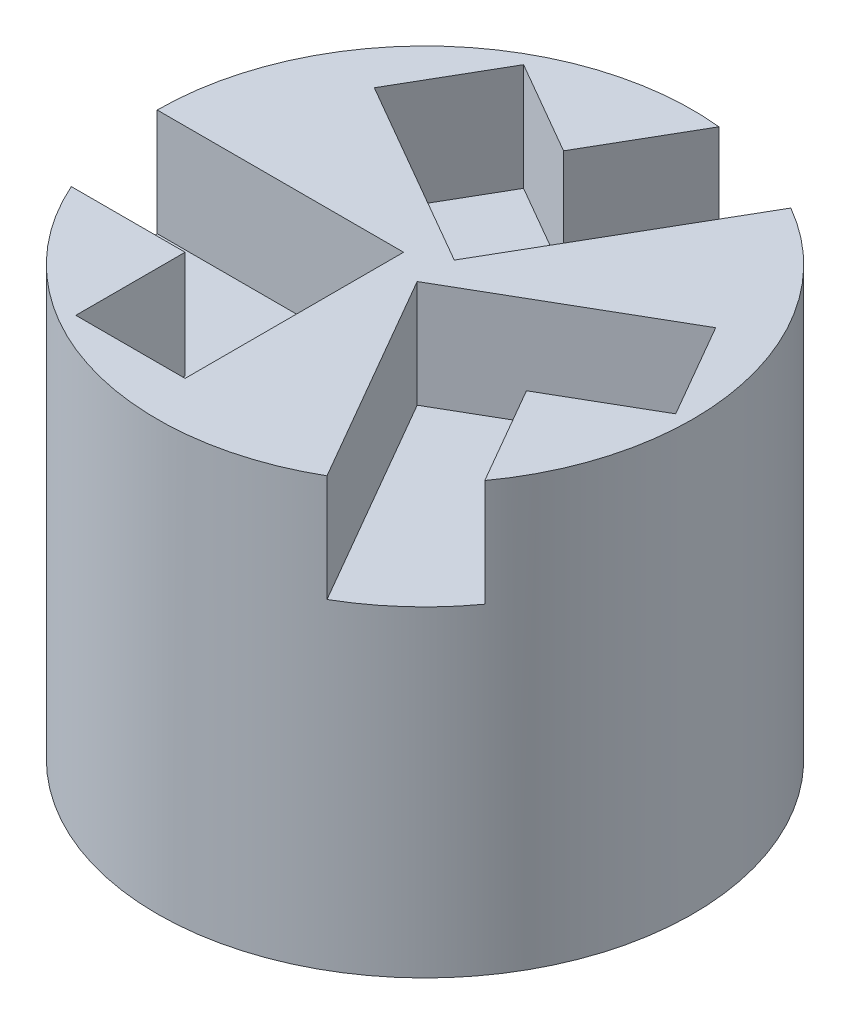
ISO-10303-21;
HEADER;
FILE_DESCRIPTION(('STEP AP214'),'2;1');
FILE_NAME('part.step','',(''),(''),'','','');
FILE_SCHEMA(('AUTOMOTIVE_DESIGN { 1 0 10303 214 1 1 1 1 }'));
ENDSEC;
DATA;
#1=APPLICATION_CONTEXT('core data for automotive mechanical design processes');
#2=APPLICATION_PROTOCOL_DEFINITION('international standard','automotive_design',2000,#1);
#3=PRODUCT_CONTEXT('',#1,'mechanical');
#4=PRODUCT('Part','Part','',(#3));
#5=PRODUCT_RELATED_PRODUCT_CATEGORY('part','',(#4));
#6=PRODUCT_DEFINITION_FORMATION('','',#4);
#7=PRODUCT_DEFINITION_CONTEXT('part definition',#1,'design');
#8=PRODUCT_DEFINITION('design','',#6,#7);
#9=PRODUCT_DEFINITION_SHAPE('','',#8);
#10=(LENGTH_UNIT() NAMED_UNIT(*) SI_UNIT(.MILLI.,.METRE.));
#11=(NAMED_UNIT(*) PLANE_ANGLE_UNIT() SI_UNIT($,.RADIAN.));
#12=(NAMED_UNIT(*) SI_UNIT($,.STERADIAN.) SOLID_ANGLE_UNIT());
#13=UNCERTAINTY_MEASURE_WITH_UNIT(LENGTH_MEASURE(1.E-05),#10,'distance_accuracy_value','');
#14=(GEOMETRIC_REPRESENTATION_CONTEXT(3) GLOBAL_UNCERTAINTY_ASSIGNED_CONTEXT((#13)) GLOBAL_UNIT_ASSIGNED_CONTEXT((#10,
#11,#12)) REPRESENTATION_CONTEXT('',''));
#15=CARTESIAN_POINT('',(0.,0.,0.));
#16=DIRECTION('',(0.,0.,1.));
#17=DIRECTION('',(1.,0.,0.));
#18=AXIS2_PLACEMENT_3D('',#15,#16,#17);
#19=CARTESIAN_POINT('',(0.,40.,0.));
#20=DIRECTION('',(0.,-1.,0.));
#21=DIRECTION('',(0.,0.,-1.));
#22=AXIS2_PLACEMENT_3D('',#19,#20,#21);
#23=CYLINDRICAL_SURFACE('',#22,25.);
#24=CARTESIAN_POINT('',(0.,30.,0.));
#25=DIRECTION('',(0.,1.,0.));
#26=DIRECTION('',(0.866025403784443,0.,-0.499999999999992));
#27=AXIS2_PLACEMENT_3D('',#24,#25,#26);
#28=CIRCLE('',#27,25.);
#29=CARTESIAN_POINT('',(12.4999999999998,30.,21.6506350946111));
#30=VERTEX_POINT('',#29);
#31=CARTESIAN_POINT('',(20.2457332127508,30.,14.6666385609695));
#32=VERTEX_POINT('',#31);
#33=EDGE_CURVE('E172',#30,#32,#28,.T.);
#34=ORIENTED_EDGE('',*,*,#33,.F.);
#35=DIRECTION('',(0.,1.,0.));
#36=VECTOR('',#35,1.);
#37=CARTESIAN_POINT('',(12.4999999999998,30.,21.6506350946111));
#38=LINE('',#37,#36);
#39=CARTESIAN_POINT('',(12.4999999999998,40.,21.6506350946111));
#40=VERTEX_POINT('',#39);
#41=EDGE_CURVE('E217',#30,#40,#38,.T.);
#42=ORIENTED_EDGE('',*,*,#41,.T.);
#43=CARTESIAN_POINT('',(0.,40.,0.));
#44=DIRECTION('',(0.,1.,0.));
#45=DIRECTION('',(0.,0.,1.));
#46=AXIS2_PLACEMENT_3D('',#43,#44,#45);
#47=CIRCLE('',#46,25.);
#48=CARTESIAN_POINT('',(-22.8245481882994,40.,10.2));
#49=VERTEX_POINT('',#48);
#50=EDGE_CURVE('E11',#49,#40,#47,.T.);
#51=ORIENTED_EDGE('',*,*,#50,.F.);
#52=DIRECTION('',(0.,1.,0.));
#53=VECTOR('',#52,1.);
#54=CARTESIAN_POINT('',(-22.8245481882994,30.,10.2));
#55=LINE('',#54,#53);
#56=CARTESIAN_POINT('',(-22.8245481882994,30.,10.2));
#57=VERTEX_POINT('',#56);
#58=EDGE_CURVE('E258',#57,#49,#55,.T.);
#59=ORIENTED_EDGE('',*,*,#58,.F.);
#60=CARTESIAN_POINT('',(0.,30.,0.));
#61=DIRECTION('',(0.,1.,0.));
#62=DIRECTION('',(0.,0.,1.));
#63=AXIS2_PLACEMENT_3D('',#60,#61,#62);
#64=CIRCLE('',#63,25.);
#65=CARTESIAN_POINT('',(-25.,30.,0.));
#66=VERTEX_POINT('',#65);
#67=EDGE_CURVE('E239',#66,#57,#64,.T.);
#68=ORIENTED_EDGE('',*,*,#67,.F.);
#69=DIRECTION('',(0.,1.,0.));
#70=VECTOR('',#69,1.);
#71=CARTESIAN_POINT('',(-25.,30.,0.));
#72=LINE('',#71,#70);
#73=CARTESIAN_POINT('',(-25.,40.,0.));
#74=VERTEX_POINT('',#73);
#75=EDGE_CURVE('E272',#66,#74,#72,.T.);
#76=ORIENTED_EDGE('',*,*,#75,.T.);
#77=CARTESIAN_POINT('',(2.57881497554853,40.,-24.8666385609693));
#78=VERTEX_POINT('',#77);
#79=EDGE_CURVE('E47',#78,#74,#47,.T.);
#80=ORIENTED_EDGE('',*,*,#79,.F.);
#81=DIRECTION('',(0.,1.,0.));
#82=VECTOR('',#81,1.);
#83=CARTESIAN_POINT('',(2.57881497554853,30.,-24.8666385609693));
#84=LINE('',#83,#82);
#85=CARTESIAN_POINT('',(2.57881497554853,30.,-24.8666385609693));
#86=VERTEX_POINT('',#85);
#87=EDGE_CURVE('E54',#86,#78,#84,.T.);
#88=ORIENTED_EDGE('',*,*,#87,.F.);
#89=CARTESIAN_POINT('',(0.,30.,0.));
#90=DIRECTION('',(0.,1.,0.));
#91=DIRECTION('',(-0.866025403784436,0.,-0.500000000000004));
#92=AXIS2_PLACEMENT_3D('',#89,#90,#91);
#93=CIRCLE('',#92,25.);
#94=CARTESIAN_POINT('',(12.5000000000001,30.,-21.6506350946109));
#95=VERTEX_POINT('',#94);
#96=EDGE_CURVE('E195',#95,#86,#93,.T.);
#97=ORIENTED_EDGE('',*,*,#96,.F.);
#98=DIRECTION('',(0.,1.,0.));
#99=VECTOR('',#98,1.);
#100=CARTESIAN_POINT('',(12.5000000000001,30.,-21.6506350946109));
#101=LINE('',#100,#99);
#102=CARTESIAN_POINT('',(12.5000000000001,40.,-21.6506350946109));
#103=VERTEX_POINT('',#102);
#104=EDGE_CURVE('E227',#95,#103,#101,.T.);
#105=ORIENTED_EDGE('',*,*,#104,.T.);
#106=CARTESIAN_POINT('',(20.2457332127508,40.,14.6666385609695));
#107=VERTEX_POINT('',#106);
#108=EDGE_CURVE('E46',#107,#103,#47,.T.);
#109=ORIENTED_EDGE('',*,*,#108,.F.);
#110=DIRECTION('',(0.,1.,0.));
#111=VECTOR('',#110,1.);
#112=CARTESIAN_POINT('',(20.2457332127508,30.,14.6666385609695));
#113=LINE('',#112,#111);
#114=EDGE_CURVE('E62',#32,#107,#113,.T.);
#115=ORIENTED_EDGE('',*,*,#114,.F.);
#116=EDGE_LOOP('',(#34,#42,#51,#59,#68,#76,#80,#88,#97,#105,#109,#115));
#117=FACE_BOUND('',#116,.T.);
#118=CARTESIAN_POINT('',(0.,0.,0.));
#119=DIRECTION('',(0.,1.,0.));
#120=DIRECTION('',(0.,0.,1.));
#121=AXIS2_PLACEMENT_3D('',#118,#119,#120);
#122=CIRCLE('',#121,25.);
#123=CARTESIAN_POINT('',(0.,0.,25.));
#124=VERTEX_POINT('',#123);
#125=EDGE_CURVE('E41',#124,#124,#122,.T.);
#126=ORIENTED_EDGE('',*,*,#125,.T.);
#127=EDGE_LOOP('',(#126));
#128=FACE_BOUND('',#127,.T.);
#129=ADVANCED_FACE('F38',(#117,#128),#23,.T.);
#130=CARTESIAN_POINT('',(0.,40.,0.));
#131=DIRECTION('',(0.,1.,0.));
#132=DIRECTION('',(0.,0.,1.));
#133=AXIS2_PLACEMENT_3D('',#130,#131,#132);
#134=PLANE('',#133);
#135=DIRECTION('',(0.499999999999992,0.,0.866025403784443));
#136=VECTOR('',#135,1.);
#137=CARTESIAN_POINT('',(12.4999999999998,40.,21.6506350946111));
#138=LINE('',#137,#136);
#139=CARTESIAN_POINT('',(0.999999999999984,40.,1.73205080756889));
#140=VERTEX_POINT('',#139);
#141=EDGE_CURVE('E182',#140,#40,#138,.T.);
#142=ORIENTED_EDGE('',*,*,#141,.F.);
#143=DIRECTION('',(-0.866025403784443,0.,0.499999999999992));
#144=VECTOR('',#143,1.);
#145=CARTESIAN_POINT('',(0.999999999999984,40.,1.73205080756889));
#146=LINE('',#145,#144);
#147=CARTESIAN_POINT('',(18.6669182372026,40.,-8.46794919243095));
#148=VERTEX_POINT('',#147);
#149=EDGE_CURVE('E319',#148,#140,#146,.T.);
#150=ORIENTED_EDGE('',*,*,#149,.F.);
#151=DIRECTION('',(-0.499999999999992,0.,-0.866025403784443));
#152=VECTOR('',#151,1.);
#153=CARTESIAN_POINT('',(18.6669182372026,40.,-8.46794919243095));
#154=LINE('',#153,#152);
#155=CARTESIAN_POINT('',(23.7669182372025,40.,0.36550992617037));
#156=VERTEX_POINT('',#155);
#157=EDGE_CURVE('E308',#156,#148,#154,.T.);
#158=ORIENTED_EDGE('',*,*,#157,.F.);
#159=DIRECTION('',(0.866025403784443,0.,-0.499999999999992));
#160=VECTOR('',#159,1.);
#161=CARTESIAN_POINT('',(23.7669182372025,40.,0.36550992617037));
#162=LINE('',#161,#160);
#163=CARTESIAN_POINT('',(14.9334591186012,40.,5.46550992617029));
#164=VERTEX_POINT('',#163);
#165=EDGE_CURVE('E314',#164,#156,#162,.T.);
#166=ORIENTED_EDGE('',*,*,#165,.F.);
#167=DIRECTION('',(-0.499999999999992,0.,-0.866025403784443));
#168=VECTOR('',#167,1.);
#169=CARTESIAN_POINT('',(14.9334591186012,40.,5.46550992617029));
#170=LINE('',#169,#168);
#171=EDGE_CURVE('E316',#107,#164,#170,.T.);
#172=ORIENTED_EDGE('',*,*,#171,.F.);
#173=ORIENTED_EDGE('',*,*,#108,.T.);
#174=DIRECTION('',(0.500000000000004,0.,-0.866025403784436));
#175=VECTOR('',#174,1.);
#176=CARTESIAN_POINT('',(12.5000000000001,40.,-21.6506350946109));
#177=LINE('',#176,#175);
#178=CARTESIAN_POINT('',(1.00000000000001,40.,-1.73205080756887));
#179=VERTEX_POINT('',#178);
#180=EDGE_CURVE('E199',#179,#103,#177,.T.);
#181=ORIENTED_EDGE('',*,*,#180,.F.);
#182=DIRECTION('',(0.866025403784437,0.,0.500000000000004));
#183=VECTOR('',#182,1.);
#184=CARTESIAN_POINT('',(1.00000000000001,40.,-1.73205080756887));
#185=LINE('',#184,#183);
#186=CARTESIAN_POINT('',(-16.6669182372025,40.,-11.932050807569));
#187=VERTEX_POINT('',#186);
#188=EDGE_CURVE('E223',#187,#179,#185,.T.);
#189=ORIENTED_EDGE('',*,*,#188,.F.);
#190=DIRECTION('',(-0.500000000000004,0.,0.866025403784436));
#191=VECTOR('',#190,1.);
#192=CARTESIAN_POINT('',(-16.6669182372025,40.,-11.932050807569));
#193=LINE('',#192,#191);
#194=CARTESIAN_POINT('',(-11.5669182372025,40.,-20.7655099261702));
#195=VERTEX_POINT('',#194);
#196=EDGE_CURVE('E220',#195,#187,#193,.T.);
#197=ORIENTED_EDGE('',*,*,#196,.F.);
#198=DIRECTION('',(-0.866025403784436,0.,-0.500000000000004));
#199=VECTOR('',#198,1.);
#200=CARTESIAN_POINT('',(-11.5669182372025,40.,-20.7655099261702));
#201=LINE('',#200,#199);
#202=CARTESIAN_POINT('',(-2.7334591186012,40.,-15.6655099261702));
#203=VERTEX_POINT('',#202);
#204=EDGE_CURVE('E216',#203,#195,#201,.T.);
#205=ORIENTED_EDGE('',*,*,#204,.F.);
#206=DIRECTION('',(-0.500000000000004,0.,0.866025403784436));
#207=VECTOR('',#206,1.);
#208=CARTESIAN_POINT('',(-2.7334591186012,40.,-15.6655099261702));
#209=LINE('',#208,#207);
#210=EDGE_CURVE('E214',#78,#203,#209,.T.);
#211=ORIENTED_EDGE('',*,*,#210,.F.);
#212=ORIENTED_EDGE('',*,*,#79,.T.);
#213=DIRECTION('',(-1.,0.,0.));
#214=VECTOR('',#213,1.);
#215=CARTESIAN_POINT('',(-25.,40.,0.));
#216=LINE('',#215,#214);
#217=CARTESIAN_POINT('',(-2.,40.,0.));
#218=VERTEX_POINT('',#217);
#219=EDGE_CURVE('E243',#218,#74,#216,.T.);
#220=ORIENTED_EDGE('',*,*,#219,.F.);
#221=DIRECTION('',(0.,0.,-1.));
#222=VECTOR('',#221,1.);
#223=CARTESIAN_POINT('',(-2.,40.,0.));
#224=LINE('',#223,#222);
#225=CARTESIAN_POINT('',(-2.,40.,20.4));
#226=VERTEX_POINT('',#225);
#227=EDGE_CURVE('E267',#226,#218,#224,.T.);
#228=ORIENTED_EDGE('',*,*,#227,.F.);
#229=DIRECTION('',(1.,0.,0.));
#230=VECTOR('',#229,1.);
#231=CARTESIAN_POINT('',(-2.,40.,20.4));
#232=LINE('',#231,#230);
#233=CARTESIAN_POINT('',(-12.2,40.,20.4));
#234=VERTEX_POINT('',#233);
#235=EDGE_CURVE('E264',#234,#226,#232,.T.);
#236=ORIENTED_EDGE('',*,*,#235,.F.);
#237=DIRECTION('',(0.,0.,1.));
#238=VECTOR('',#237,1.);
#239=CARTESIAN_POINT('',(-12.2,40.,20.4));
#240=LINE('',#239,#238);
#241=CARTESIAN_POINT('',(-12.2,40.,10.2));
#242=VERTEX_POINT('',#241);
#243=EDGE_CURVE('E261',#242,#234,#240,.T.);
#244=ORIENTED_EDGE('',*,*,#243,.F.);
#245=DIRECTION('',(1.,0.,0.));
#246=VECTOR('',#245,1.);
#247=CARTESIAN_POINT('',(-12.2,40.,10.2));
#248=LINE('',#247,#246);
#249=EDGE_CURVE('E229',#49,#242,#248,.T.);
#250=ORIENTED_EDGE('',*,*,#249,.F.);
#251=ORIENTED_EDGE('',*,*,#50,.T.);
#252=EDGE_LOOP('',(#142,#150,#158,#166,#172,#173,#181,#189,#197,#205,#211,#212,#220,#228,#236,
#244,#250,#251));
#253=FACE_BOUND('',#252,.T.);
#254=ADVANCED_FACE('F292',(#253),#134,.T.);
#255=CARTESIAN_POINT('',(0.,0.,0.));
#256=DIRECTION('',(0.,1.,0.));
#257=DIRECTION('',(0.,0.,1.));
#258=AXIS2_PLACEMENT_3D('',#255,#256,#257);
#259=PLANE('',#258);
#260=CARTESIAN_POINT('',(0.,0.,0.));
#261=DIRECTION('',(0.,-1.,0.));
#262=DIRECTION('',(0.,0.,-1.));
#263=AXIS2_PLACEMENT_3D('',#260,#261,#262);
#264=CIRCLE('',#263,15.1);
#265=CARTESIAN_POINT('',(0.,0.,-15.1));
#266=VERTEX_POINT('',#265);
#267=EDGE_CURVE('E327',#266,#266,#264,.T.);
#268=ORIENTED_EDGE('',*,*,#267,.F.);
#269=EDGE_LOOP('',(#268));
#270=FACE_BOUND('',#269,.T.);
#271=ORIENTED_EDGE('',*,*,#125,.F.);
#272=EDGE_LOOP('',(#271));
#273=FACE_BOUND('',#272,.T.);
#274=ADVANCED_FACE('F341',(#270,#273),#259,.F.);
#275=CARTESIAN_POINT('',(-25.,30.,0.));
#276=DIRECTION('',(0.,0.,-1.));
#277=DIRECTION('',(-1.,0.,0.));
#278=AXIS2_PLACEMENT_3D('',#275,#276,#277);
#279=PLANE('',#278);
#280=ORIENTED_EDGE('',*,*,#219,.T.);
#281=ORIENTED_EDGE('',*,*,#75,.F.);
#282=DIRECTION('',(-1.,0.,0.));
#283=VECTOR('',#282,1.);
#284=CARTESIAN_POINT('',(-25.,30.,0.));
#285=LINE('',#284,#283);
#286=CARTESIAN_POINT('',(-2.,30.,0.));
#287=VERTEX_POINT('',#286);
#288=EDGE_CURVE('E255',#287,#66,#285,.T.);
#289=ORIENTED_EDGE('',*,*,#288,.F.);
#290=DIRECTION('',(0.,1.,0.));
#291=VECTOR('',#290,1.);
#292=CARTESIAN_POINT('',(-2.,30.,0.));
#293=LINE('',#292,#291);
#294=EDGE_CURVE('E275',#287,#218,#293,.T.);
#295=ORIENTED_EDGE('',*,*,#294,.T.);
#296=EDGE_LOOP('',(#280,#281,#289,#295));
#297=FACE_BOUND('',#296,.T.);
#298=ADVANCED_FACE('F344',(#297),#279,.F.);
#299=CARTESIAN_POINT('',(-2.,30.,0.));
#300=DIRECTION('',(1.,0.,0.));
#301=DIRECTION('',(0.,0.,-1.));
#302=AXIS2_PLACEMENT_3D('',#299,#300,#301);
#303=PLANE('',#302);
#304=ORIENTED_EDGE('',*,*,#227,.T.);
#305=ORIENTED_EDGE('',*,*,#294,.F.);
#306=DIRECTION('',(0.,0.,-1.));
#307=VECTOR('',#306,1.);
#308=CARTESIAN_POINT('',(-2.,30.,0.));
#309=LINE('',#308,#307);
#310=CARTESIAN_POINT('',(-2.,30.,20.4));
#311=VERTEX_POINT('',#310);
#312=EDGE_CURVE('E252',#311,#287,#309,.T.);
#313=ORIENTED_EDGE('',*,*,#312,.F.);
#314=DIRECTION('',(0.,1.,0.));
#315=VECTOR('',#314,1.);
#316=CARTESIAN_POINT('',(-2.,30.,20.4));
#317=LINE('',#316,#315);
#318=EDGE_CURVE('E277',#311,#226,#317,.T.);
#319=ORIENTED_EDGE('',*,*,#318,.T.);
#320=EDGE_LOOP('',(#304,#305,#313,#319));
#321=FACE_BOUND('',#320,.T.);
#322=ADVANCED_FACE('F399',(#321),#303,.F.);
#323=CARTESIAN_POINT('',(-2.,30.,20.4));
#324=DIRECTION('',(0.,0.,1.));
#325=DIRECTION('',(1.,0.,0.));
#326=AXIS2_PLACEMENT_3D('',#323,#324,#325);
#327=PLANE('',#326);
#328=ORIENTED_EDGE('',*,*,#235,.T.);
#329=ORIENTED_EDGE('',*,*,#318,.F.);
#330=DIRECTION('',(1.,0.,0.));
#331=VECTOR('',#330,1.);
#332=CARTESIAN_POINT('',(-2.,30.,20.4));
#333=LINE('',#332,#331);
#334=CARTESIAN_POINT('',(-12.2,30.,20.4));
#335=VERTEX_POINT('',#334);
#336=EDGE_CURVE('E249',#335,#311,#333,.T.);
#337=ORIENTED_EDGE('',*,*,#336,.F.);
#338=DIRECTION('',(0.,1.,0.));
#339=VECTOR('',#338,1.);
#340=CARTESIAN_POINT('',(-12.2,30.,20.4));
#341=LINE('',#340,#339);
#342=EDGE_CURVE('E279',#335,#234,#341,.T.);
#343=ORIENTED_EDGE('',*,*,#342,.T.);
#344=EDGE_LOOP('',(#328,#329,#337,#343));
#345=FACE_BOUND('',#344,.T.);
#346=ADVANCED_FACE('F395',(#345),#327,.F.);
#347=CARTESIAN_POINT('',(-12.2,30.,20.4));
#348=DIRECTION('',(-1.,0.,0.));
#349=DIRECTION('',(0.,0.,1.));
#350=AXIS2_PLACEMENT_3D('',#347,#348,#349);
#351=PLANE('',#350);
#352=ORIENTED_EDGE('',*,*,#243,.T.);
#353=ORIENTED_EDGE('',*,*,#342,.F.);
#354=DIRECTION('',(0.,0.,1.));
#355=VECTOR('',#354,1.);
#356=CARTESIAN_POINT('',(-12.2,30.,20.4));
#357=LINE('',#356,#355);
#358=CARTESIAN_POINT('',(-12.2,30.,10.2));
#359=VERTEX_POINT('',#358);
#360=EDGE_CURVE('E246',#359,#335,#357,.T.);
#361=ORIENTED_EDGE('',*,*,#360,.F.);
#362=DIRECTION('',(0.,1.,0.));
#363=VECTOR('',#362,1.);
#364=CARTESIAN_POINT('',(-12.2,30.,10.2));
#365=LINE('',#364,#363);
#366=EDGE_CURVE('E281',#359,#242,#365,.T.);
#367=ORIENTED_EDGE('',*,*,#366,.T.);
#368=EDGE_LOOP('',(#352,#353,#361,#367));
#369=FACE_BOUND('',#368,.T.);
#370=ADVANCED_FACE('F392',(#369),#351,.F.);
#371=CARTESIAN_POINT('',(-12.2,30.,10.2));
#372=DIRECTION('',(0.,0.,1.));
#373=DIRECTION('',(1.,0.,0.));
#374=AXIS2_PLACEMENT_3D('',#371,#372,#373);
#375=PLANE('',#374);
#376=ORIENTED_EDGE('',*,*,#249,.T.);
#377=ORIENTED_EDGE('',*,*,#366,.F.);
#378=DIRECTION('',(1.,0.,0.));
#379=VECTOR('',#378,1.);
#380=CARTESIAN_POINT('',(-12.2,30.,10.2));
#381=LINE('',#380,#379);
#382=EDGE_CURVE('E242',#57,#359,#381,.T.);
#383=ORIENTED_EDGE('',*,*,#382,.F.);
#384=ORIENTED_EDGE('',*,*,#58,.T.);
#385=EDGE_LOOP('',(#376,#377,#383,#384));
#386=FACE_BOUND('',#385,.T.);
#387=ADVANCED_FACE('F286',(#386),#375,.F.);
#388=CARTESIAN_POINT('',(0.,30.,0.));
#389=DIRECTION('',(0.,1.,0.));
#390=DIRECTION('',(0.,0.,1.));
#391=AXIS2_PLACEMENT_3D('',#388,#389,#390);
#392=PLANE('',#391);
#393=ORIENTED_EDGE('',*,*,#67,.T.);
#394=ORIENTED_EDGE('',*,*,#382,.T.);
#395=ORIENTED_EDGE('',*,*,#360,.T.);
#396=ORIENTED_EDGE('',*,*,#336,.T.);
#397=ORIENTED_EDGE('',*,*,#312,.T.);
#398=ORIENTED_EDGE('',*,*,#288,.T.);
#399=EDGE_LOOP('',(#393,#394,#395,#396,#397,#398));
#400=FACE_BOUND('',#399,.T.);
#401=ADVANCED_FACE('F391',(#400),#392,.T.);
#402=CARTESIAN_POINT('',(12.5000000000001,30.,-21.6506350946109));
#403=DIRECTION('',(0.866025403784436,0.,0.500000000000004));
#404=DIRECTION('',(0.500000000000004,0.,-0.866025403784436));
#405=AXIS2_PLACEMENT_3D('',#402,#403,#404);
#406=PLANE('',#405);
#407=ORIENTED_EDGE('',*,*,#180,.T.);
#408=ORIENTED_EDGE('',*,*,#104,.F.);
#409=DIRECTION('',(0.500000000000004,0.,-0.866025403784436));
#410=VECTOR('',#409,1.);
#411=CARTESIAN_POINT('',(12.5000000000001,30.,-21.6506350946109));
#412=LINE('',#411,#410);
#413=CARTESIAN_POINT('',(1.00000000000001,30.,-1.73205080756887));
#414=VERTEX_POINT('',#413);
#415=EDGE_CURVE('E211',#414,#95,#412,.T.);
#416=ORIENTED_EDGE('',*,*,#415,.F.);
#417=DIRECTION('',(0.,1.,0.));
#418=VECTOR('',#417,1.);
#419=CARTESIAN_POINT('',(1.00000000000001,30.,-1.73205080756887));
#420=LINE('',#419,#418);
#421=EDGE_CURVE('E230',#414,#179,#420,.T.);
#422=ORIENTED_EDGE('',*,*,#421,.T.);
#423=EDGE_LOOP('',(#407,#408,#416,#422));
#424=FACE_BOUND('',#423,.T.);
#425=ADVANCED_FACE('F353',(#424),#406,.F.);
#426=CARTESIAN_POINT('',(1.00000000000001,30.,-1.73205080756887));
#427=DIRECTION('',(-0.500000000000004,0.,0.866025403784436));
#428=DIRECTION('',(0.866025403784436,0.,0.500000000000004));
#429=AXIS2_PLACEMENT_3D('',#426,#427,#428);
#430=PLANE('',#429);
#431=ORIENTED_EDGE('',*,*,#188,.T.);
#432=ORIENTED_EDGE('',*,*,#421,.F.);
#433=DIRECTION('',(0.866025403784437,0.,0.500000000000004));
#434=VECTOR('',#433,1.);
#435=CARTESIAN_POINT('',(1.00000000000001,30.,-1.73205080756887));
#436=LINE('',#435,#434);
#437=CARTESIAN_POINT('',(-16.6669182372025,30.,-11.932050807569));
#438=VERTEX_POINT('',#437);
#439=EDGE_CURVE('E208',#438,#414,#436,.T.);
#440=ORIENTED_EDGE('',*,*,#439,.F.);
#441=DIRECTION('',(0.,1.,0.));
#442=VECTOR('',#441,1.);
#443=CARTESIAN_POINT('',(-16.6669182372025,30.,-11.932050807569));
#444=LINE('',#443,#442);
#445=EDGE_CURVE('E232',#438,#187,#444,.T.);
#446=ORIENTED_EDGE('',*,*,#445,.T.);
#447=EDGE_LOOP('',(#431,#432,#440,#446));
#448=FACE_BOUND('',#447,.T.);
#449=ADVANCED_FACE('F361',(#448),#430,.F.);
#450=CARTESIAN_POINT('',(-16.6669182372025,30.,-11.932050807569));
#451=DIRECTION('',(-0.866025403784436,0.,-0.500000000000004));
#452=DIRECTION('',(-0.500000000000004,0.,0.866025403784436));
#453=AXIS2_PLACEMENT_3D('',#450,#451,#452);
#454=PLANE('',#453);
#455=ORIENTED_EDGE('',*,*,#196,.T.);
#456=ORIENTED_EDGE('',*,*,#445,.F.);
#457=DIRECTION('',(-0.500000000000004,0.,0.866025403784436));
#458=VECTOR('',#457,1.);
#459=CARTESIAN_POINT('',(-16.6669182372025,30.,-11.932050807569));
#460=LINE('',#459,#458);
#461=CARTESIAN_POINT('',(-11.5669182372025,30.,-20.7655099261702));
#462=VERTEX_POINT('',#461);
#463=EDGE_CURVE('E205',#462,#438,#460,.T.);
#464=ORIENTED_EDGE('',*,*,#463,.F.);
#465=DIRECTION('',(0.,1.,0.));
#466=VECTOR('',#465,1.);
#467=CARTESIAN_POINT('',(-11.5669182372025,30.,-20.7655099261702));
#468=LINE('',#467,#466);
#469=EDGE_CURVE('E234',#462,#195,#468,.T.);
#470=ORIENTED_EDGE('',*,*,#469,.T.);
#471=EDGE_LOOP('',(#455,#456,#464,#470));
#472=FACE_BOUND('',#471,.T.);
#473=ADVANCED_FACE('F363',(#472),#454,.F.);
#474=CARTESIAN_POINT('',(-11.5669182372025,30.,-20.7655099261702));
#475=DIRECTION('',(0.500000000000004,0.,-0.866025403784436));
#476=DIRECTION('',(-0.866025403784436,0.,-0.500000000000004));
#477=AXIS2_PLACEMENT_3D('',#474,#475,#476);
#478=PLANE('',#477);
#479=ORIENTED_EDGE('',*,*,#204,.T.);
#480=ORIENTED_EDGE('',*,*,#469,.F.);
#481=DIRECTION('',(-0.866025403784436,0.,-0.500000000000004));
#482=VECTOR('',#481,1.);
#483=CARTESIAN_POINT('',(-11.5669182372025,30.,-20.7655099261702));
#484=LINE('',#483,#482);
#485=CARTESIAN_POINT('',(-2.7334591186012,30.,-15.6655099261702));
#486=VERTEX_POINT('',#485);
#487=EDGE_CURVE('E202',#486,#462,#484,.T.);
#488=ORIENTED_EDGE('',*,*,#487,.F.);
#489=DIRECTION('',(0.,1.,0.));
#490=VECTOR('',#489,1.);
#491=CARTESIAN_POINT('',(-2.7334591186012,30.,-15.6655099261702));
#492=LINE('',#491,#490);
#493=EDGE_CURVE('E236',#486,#203,#492,.T.);
#494=ORIENTED_EDGE('',*,*,#493,.T.);
#495=EDGE_LOOP('',(#479,#480,#488,#494));
#496=FACE_BOUND('',#495,.T.);
#497=ADVANCED_FACE('F366',(#496),#478,.F.);
#498=CARTESIAN_POINT('',(-2.7334591186012,30.,-15.6655099261702));
#499=DIRECTION('',(-0.866025403784436,0.,-0.500000000000004));
#500=DIRECTION('',(-0.500000000000004,0.,0.866025403784436));
#501=AXIS2_PLACEMENT_3D('',#498,#499,#500);
#502=PLANE('',#501);
#503=ORIENTED_EDGE('',*,*,#210,.T.);
#504=ORIENTED_EDGE('',*,*,#493,.F.);
#505=DIRECTION('',(-0.500000000000004,0.,0.866025403784436));
#506=VECTOR('',#505,1.);
#507=CARTESIAN_POINT('',(-2.7334591186012,30.,-15.6655099261702));
#508=LINE('',#507,#506);
#509=EDGE_CURVE('E198',#86,#486,#508,.T.);
#510=ORIENTED_EDGE('',*,*,#509,.F.);
#511=ORIENTED_EDGE('',*,*,#87,.T.);
#512=EDGE_LOOP('',(#503,#504,#510,#511));
#513=FACE_BOUND('',#512,.T.);
#514=ADVANCED_FACE('F368',(#513),#502,.F.);
#515=CARTESIAN_POINT('',(0.,30.,0.));
#516=DIRECTION('',(0.,1.,0.));
#517=DIRECTION('',(-0.866025403784436,0.,-0.500000000000004));
#518=AXIS2_PLACEMENT_3D('',#515,#516,#517);
#519=PLANE('',#518);
#520=ORIENTED_EDGE('',*,*,#96,.T.);
#521=ORIENTED_EDGE('',*,*,#509,.T.);
#522=ORIENTED_EDGE('',*,*,#487,.T.);
#523=ORIENTED_EDGE('',*,*,#463,.T.);
#524=ORIENTED_EDGE('',*,*,#439,.T.);
#525=ORIENTED_EDGE('',*,*,#415,.T.);
#526=EDGE_LOOP('',(#520,#521,#522,#523,#524,#525));
#527=FACE_BOUND('',#526,.T.);
#528=ADVANCED_FACE('F357',(#527),#519,.T.);
#529=CARTESIAN_POINT('',(12.4999999999998,30.,21.6506350946111));
#530=DIRECTION('',(-0.866025403784443,0.,0.499999999999992));
#531=DIRECTION('',(0.499999999999992,0.,0.866025403784443));
#532=AXIS2_PLACEMENT_3D('',#529,#530,#531);
#533=PLANE('',#532);
#534=ORIENTED_EDGE('',*,*,#141,.T.);
#535=ORIENTED_EDGE('',*,*,#41,.F.);
#536=DIRECTION('',(0.499999999999992,0.,0.866025403784443));
#537=VECTOR('',#536,1.);
#538=CARTESIAN_POINT('',(12.4999999999998,30.,21.6506350946111));
#539=LINE('',#538,#537);
#540=CARTESIAN_POINT('',(0.999999999999984,30.,1.73205080756889));
#541=VERTEX_POINT('',#540);
#542=EDGE_CURVE('E179',#541,#30,#539,.T.);
#543=ORIENTED_EDGE('',*,*,#542,.F.);
#544=DIRECTION('',(0.,1.,0.));
#545=VECTOR('',#544,1.);
#546=CARTESIAN_POINT('',(0.999999999999984,30.,1.73205080756889));
#547=LINE('',#546,#545);
#548=EDGE_CURVE('E295',#541,#140,#547,.T.);
#549=ORIENTED_EDGE('',*,*,#548,.T.);
#550=EDGE_LOOP('',(#534,#535,#543,#549));
#551=FACE_BOUND('',#550,.T.);
#552=ADVANCED_FACE('F375',(#551),#533,.F.);
#553=CARTESIAN_POINT('',(0.999999999999984,30.,1.73205080756889));
#554=DIRECTION('',(-0.499999999999992,0.,-0.866025403784443));
#555=DIRECTION('',(-0.866025403784443,0.,0.499999999999992));
#556=AXIS2_PLACEMENT_3D('',#553,#554,#555);
#557=PLANE('',#556);
#558=ORIENTED_EDGE('',*,*,#149,.T.);
#559=ORIENTED_EDGE('',*,*,#548,.F.);
#560=DIRECTION('',(-0.866025403784443,0.,0.499999999999992));
#561=VECTOR('',#560,1.);
#562=CARTESIAN_POINT('',(0.999999999999984,30.,1.73205080756889));
#563=LINE('',#562,#561);
#564=CARTESIAN_POINT('',(18.6669182372026,30.,-8.46794919243095));
#565=VERTEX_POINT('',#564);
#566=EDGE_CURVE('E191',#565,#541,#563,.T.);
#567=ORIENTED_EDGE('',*,*,#566,.F.);
#568=DIRECTION('',(0.,1.,0.));
#569=VECTOR('',#568,1.);
#570=CARTESIAN_POINT('',(18.6669182372026,30.,-8.46794919243095));
#571=LINE('',#570,#569);
#572=EDGE_CURVE('E297',#565,#148,#571,.T.);
#573=ORIENTED_EDGE('',*,*,#572,.T.);
#574=EDGE_LOOP('',(#558,#559,#567,#573));
#575=FACE_BOUND('',#574,.T.);
#576=ADVANCED_FACE('F451',(#575),#557,.F.);
#577=CARTESIAN_POINT('',(18.6669182372026,30.,-8.46794919243095));
#578=DIRECTION('',(0.866025403784443,0.,-0.499999999999992));
#579=DIRECTION('',(-0.499999999999992,0.,-0.866025403784443));
#580=AXIS2_PLACEMENT_3D('',#577,#578,#579);
#581=PLANE('',#580);
#582=ORIENTED_EDGE('',*,*,#157,.T.);
#583=ORIENTED_EDGE('',*,*,#572,.F.);
#584=DIRECTION('',(-0.499999999999992,0.,-0.866025403784443));
#585=VECTOR('',#584,1.);
#586=CARTESIAN_POINT('',(18.6669182372026,30.,-8.46794919243095));
#587=LINE('',#586,#585);
#588=CARTESIAN_POINT('',(23.7669182372025,30.,0.36550992617037));
#589=VERTEX_POINT('',#588);
#590=EDGE_CURVE('E311',#589,#565,#587,.T.);
#591=ORIENTED_EDGE('',*,*,#590,.F.);
#592=DIRECTION('',(0.,1.,0.));
#593=VECTOR('',#592,1.);
#594=CARTESIAN_POINT('',(23.7669182372025,30.,0.36550992617037));
#595=LINE('',#594,#593);
#596=EDGE_CURVE('E189',#589,#156,#595,.T.);
#597=ORIENTED_EDGE('',*,*,#596,.T.);
#598=EDGE_LOOP('',(#582,#583,#591,#597));
#599=FACE_BOUND('',#598,.T.);
#600=ADVANCED_FACE('F306',(#599),#581,.F.);
#601=CARTESIAN_POINT('',(23.7669182372025,30.,0.36550992617037));
#602=DIRECTION('',(0.499999999999992,0.,0.866025403784443));
#603=DIRECTION('',(0.866025403784443,0.,-0.499999999999992));
#604=AXIS2_PLACEMENT_3D('',#601,#602,#603);
#605=PLANE('',#604);
#606=ORIENTED_EDGE('',*,*,#165,.T.);
#607=ORIENTED_EDGE('',*,*,#596,.F.);
#608=DIRECTION('',(0.866025403784443,0.,-0.499999999999992));
#609=VECTOR('',#608,1.);
#610=CARTESIAN_POINT('',(23.7669182372025,30.,0.36550992617037));
#611=LINE('',#610,#609);
#612=CARTESIAN_POINT('',(14.9334591186012,30.,5.46550992617029));
#613=VERTEX_POINT('',#612);
#614=EDGE_CURVE('E171',#613,#589,#611,.T.);
#615=ORIENTED_EDGE('',*,*,#614,.F.);
#616=DIRECTION('',(0.,1.,0.));
#617=VECTOR('',#616,1.);
#618=CARTESIAN_POINT('',(14.9334591186012,30.,5.46550992617029));
#619=LINE('',#618,#617);
#620=EDGE_CURVE('E167',#613,#164,#619,.T.);
#621=ORIENTED_EDGE('',*,*,#620,.T.);
#622=EDGE_LOOP('',(#606,#607,#615,#621));
#623=FACE_BOUND('',#622,.T.);
#624=ADVANCED_FACE('F315',(#623),#605,.F.);
#625=CARTESIAN_POINT('',(14.9334591186012,30.,5.46550992617029));
#626=DIRECTION('',(0.866025403784443,0.,-0.499999999999992));
#627=DIRECTION('',(-0.499999999999992,0.,-0.866025403784443));
#628=AXIS2_PLACEMENT_3D('',#625,#626,#627);
#629=PLANE('',#628);
#630=ORIENTED_EDGE('',*,*,#171,.T.);
#631=ORIENTED_EDGE('',*,*,#620,.F.);
#632=DIRECTION('',(-0.499999999999992,0.,-0.866025403784443));
#633=VECTOR('',#632,1.);
#634=CARTESIAN_POINT('',(14.9334591186012,30.,5.46550992617029));
#635=LINE('',#634,#633);
#636=EDGE_CURVE('E164',#32,#613,#635,.T.);
#637=ORIENTED_EDGE('',*,*,#636,.F.);
#638=ORIENTED_EDGE('',*,*,#114,.T.);
#639=EDGE_LOOP('',(#630,#631,#637,#638));
#640=FACE_BOUND('',#639,.T.);
#641=ADVANCED_FACE('F166',(#640),#629,.F.);
#642=CARTESIAN_POINT('',(0.,30.,0.));
#643=DIRECTION('',(0.,1.,0.));
#644=DIRECTION('',(0.866025403784443,0.,-0.499999999999992));
#645=AXIS2_PLACEMENT_3D('',#642,#643,#644);
#646=PLANE('',#645);
#647=ORIENTED_EDGE('',*,*,#33,.T.);
#648=ORIENTED_EDGE('',*,*,#636,.T.);
#649=ORIENTED_EDGE('',*,*,#614,.T.);
#650=ORIENTED_EDGE('',*,*,#590,.T.);
#651=ORIENTED_EDGE('',*,*,#566,.T.);
#652=ORIENTED_EDGE('',*,*,#542,.T.);
#653=EDGE_LOOP('',(#647,#648,#649,#650,#651,#652));
#654=FACE_BOUND('',#653,.T.);
#655=ADVANCED_FACE('F176',(#654),#646,.T.);
#656=CARTESIAN_POINT('',(0.,8.7,0.));
#657=DIRECTION('',(0.,-1.,0.));
#658=DIRECTION('',(0.,0.,-1.));
#659=AXIS2_PLACEMENT_3D('',#656,#657,#658);
#660=CYLINDRICAL_SURFACE('',#659,15.1);
#661=CARTESIAN_POINT('',(0.,8.7,0.));
#662=DIRECTION('',(0.,-1.,0.));
#663=DIRECTION('',(0.,0.,-1.));
#664=AXIS2_PLACEMENT_3D('',#661,#662,#663);
#665=CIRCLE('',#664,15.1);
#666=CARTESIAN_POINT('',(0.,8.7,-15.1));
#667=VERTEX_POINT('',#666);
#668=EDGE_CURVE('E322',#667,#667,#665,.T.);
#669=ORIENTED_EDGE('',*,*,#668,.F.);
#670=EDGE_LOOP('',(#669));
#671=FACE_BOUND('',#670,.T.);
#672=ORIENTED_EDGE('',*,*,#267,.T.);
#673=EDGE_LOOP('',(#672));
#674=FACE_BOUND('',#673,.T.);
#675=ADVANCED_FACE('F335',(#671,#674),#660,.F.);
#676=CARTESIAN_POINT('',(0.,8.7,0.));
#677=DIRECTION('',(0.,-1.,0.));
#678=DIRECTION('',(0.,0.,-1.));
#679=AXIS2_PLACEMENT_3D('',#676,#677,#678);
#680=PLANE('',#679);
#681=ORIENTED_EDGE('',*,*,#668,.T.);
#682=EDGE_LOOP('',(#681));
#683=FACE_BOUND('',#682,.T.);
#684=ADVANCED_FACE('F333',(#683),#680,.T.);
#685=CLOSED_SHELL('',(#129,#254,#274,#298,#322,#346,#370,#387,#401,#425,#449,#473,#497,#514,
#528,#552,#576,#600,#624,#641,#655,#675,#684));
#686=MANIFOLD_SOLID_BREP('B2',#685);
#687=ADVANCED_BREP_SHAPE_REPRESENTATION('',(#18,#686),#14);
#688=SHAPE_DEFINITION_REPRESENTATION(#9,#687);
ENDSEC;
END-ISO-10303-21;
